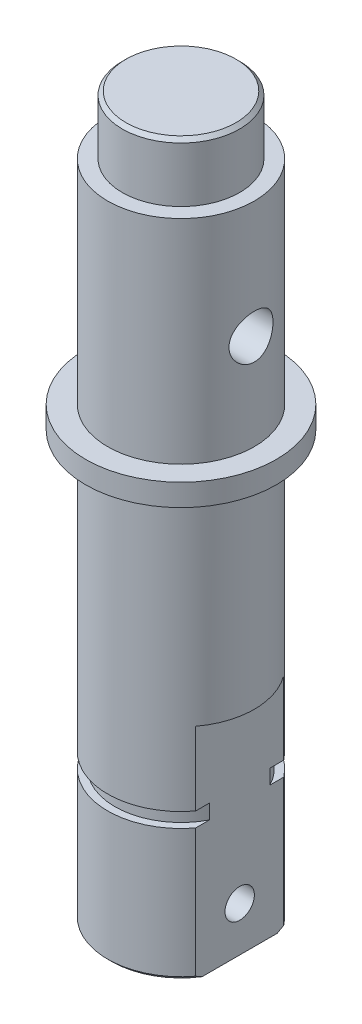
ISO-10303-21;
HEADER;
FILE_DESCRIPTION(('STEP AP214'),'2;1');
FILE_NAME('part.step','',(''),(''),'','','');
FILE_SCHEMA(('AUTOMOTIVE_DESIGN { 1 0 10303 214 1 1 1 1 }'));
ENDSEC;
DATA;
#1=APPLICATION_CONTEXT('core data for automotive mechanical design processes');
#2=APPLICATION_PROTOCOL_DEFINITION('international standard','automotive_design',2000,#1);
#3=PRODUCT_CONTEXT('',#1,'mechanical');
#4=PRODUCT('Part','Part','',(#3));
#5=PRODUCT_RELATED_PRODUCT_CATEGORY('part','',(#4));
#6=PRODUCT_DEFINITION_FORMATION('','',#4);
#7=PRODUCT_DEFINITION_CONTEXT('part definition',#1,'design');
#8=PRODUCT_DEFINITION('design','',#6,#7);
#9=PRODUCT_DEFINITION_SHAPE('','',#8);
#10=(LENGTH_UNIT() NAMED_UNIT(*) SI_UNIT(.MILLI.,.METRE.));
#11=(NAMED_UNIT(*) PLANE_ANGLE_UNIT() SI_UNIT($,.RADIAN.));
#12=(NAMED_UNIT(*) SI_UNIT($,.STERADIAN.) SOLID_ANGLE_UNIT());
#13=UNCERTAINTY_MEASURE_WITH_UNIT(LENGTH_MEASURE(1.E-05),#10,'distance_accuracy_value','');
#14=(GEOMETRIC_REPRESENTATION_CONTEXT(3) GLOBAL_UNCERTAINTY_ASSIGNED_CONTEXT((#13)) GLOBAL_UNIT_ASSIGNED_CONTEXT((#10,
#11,#12)) REPRESENTATION_CONTEXT('',''));
#15=CARTESIAN_POINT('',(0.,0.,0.));
#16=DIRECTION('',(0.,0.,1.));
#17=DIRECTION('',(1.,0.,0.));
#18=AXIS2_PLACEMENT_3D('',#15,#16,#17);
#19=CARTESIAN_POINT('',(0.,23.1069958847737,0.));
#20=DIRECTION('',(0.,-1.,0.));
#21=DIRECTION('',(0.,0.,-1.));
#22=AXIS2_PLACEMENT_3D('',#19,#20,#21);
#23=CYLINDRICAL_SURFACE('',#22,5.);
#24=CARTESIAN_POINT('',(0.,-20.8930041152263,0.));
#25=DIRECTION('',(0.,-1.,0.));
#26=DIRECTION('',(0.,0.,-1.));
#27=AXIS2_PLACEMENT_3D('',#24,#25,#26);
#28=CIRCLE('',#27,5.);
#29=CARTESIAN_POINT('',(4.,-20.8930041152263,3.));
#30=VERTEX_POINT('',#29);
#31=CARTESIAN_POINT('',(4.,-20.8930041152263,-3.));
#32=VERTEX_POINT('',#31);
#33=EDGE_CURVE('E283',#30,#32,#28,.T.);
#34=ORIENTED_EDGE('',*,*,#33,.F.);
#35=DIRECTION('',(0.,-1.,0.));
#36=VECTOR('',#35,1.);
#37=CARTESIAN_POINT('',(4.,-2.43938006815263,3.));
#38=LINE('',#37,#36);
#39=CARTESIAN_POINT('',(4.,-15.8930041152263,3.));
#40=VERTEX_POINT('',#39);
#41=EDGE_CURVE('E325',#40,#30,#38,.T.);
#42=ORIENTED_EDGE('',*,*,#41,.F.);
#43=CARTESIAN_POINT('',(0.,-15.8930041152263,0.));
#44=DIRECTION('',(0.,-1.,0.));
#45=DIRECTION('',(0.,0.,-1.));
#46=AXIS2_PLACEMENT_3D('',#43,#44,#45);
#47=CIRCLE('',#46,5.);
#48=CARTESIAN_POINT('',(4.,-15.8930041152263,-3.));
#49=VERTEX_POINT('',#48);
#50=EDGE_CURVE('E306',#49,#40,#47,.T.);
#51=ORIENTED_EDGE('',*,*,#50,.F.);
#52=DIRECTION('',(0.,-1.,0.));
#53=VECTOR('',#52,1.);
#54=CARTESIAN_POINT('',(4.,-2.43938006815263,-3.));
#55=LINE('',#54,#53);
#56=EDGE_CURVE('E320',#49,#32,#55,.T.);
#57=ORIENTED_EDGE('',*,*,#56,.T.);
#58=EDGE_LOOP('',(#34,#42,#51,#57));
#59=FACE_BOUND('',#58,.T.);
#60=CARTESIAN_POINT('',(0.,-1.89300411522634,0.));
#61=DIRECTION('',(0.,1.,0.));
#62=DIRECTION('',(0.,0.,1.));
#63=AXIS2_PLACEMENT_3D('',#60,#61,#62);
#64=CIRCLE('',#63,5.);
#65=CARTESIAN_POINT('',(0.,-1.89300411522634,5.));
#66=VERTEX_POINT('',#65);
#67=EDGE_CURVE('E294',#66,#66,#64,.T.);
#68=ORIENTED_EDGE('',*,*,#67,.F.);
#69=EDGE_LOOP('',(#68));
#70=FACE_BOUND('',#69,.T.);
#71=ADVANCED_FACE('F202',(#59,#70),#23,.T.);
#72=CARTESIAN_POINT('',(0.,-30.8930041152263,0.));
#73=DIRECTION('',(0.,-1.,0.));
#74=DIRECTION('',(0.,0.,-1.));
#75=AXIS2_PLACEMENT_3D('',#72,#73,#74);
#76=PLANE('',#75);
#77=DIRECTION('',(0.,0.,1.));
#78=VECTOR('',#77,1.);
#79=CARTESIAN_POINT('',(4.,-30.8930041152263,3.));
#80=LINE('',#79,#78);
#81=CARTESIAN_POINT('',(4.,-30.8930041152263,-2.5617376914899));
#82=VERTEX_POINT('',#81);
#83=CARTESIAN_POINT('',(4.,-30.8930041152263,2.56173769148991));
#84=VERTEX_POINT('',#83);
#85=EDGE_CURVE('E328',#82,#84,#80,.T.);
#86=ORIENTED_EDGE('',*,*,#85,.T.);
#87=CARTESIAN_POINT('',(0.,-30.8930041152263,0.));
#88=DIRECTION('',(0.,-1.,0.));
#89=DIRECTION('',(0.,0.,-1.));
#90=AXIS2_PLACEMENT_3D('',#87,#88,#89);
#91=CIRCLE('',#90,4.75);
#92=EDGE_CURVE('E421',#84,#82,#91,.T.);
#93=ORIENTED_EDGE('',*,*,#92,.T.);
#94=EDGE_LOOP('',(#86,#93));
#95=FACE_BOUND('',#94,.T.);
#96=CARTESIAN_POINT('',(0.,-30.8930041152263,0.));
#97=DIRECTION('',(0.,-1.,0.));
#98=DIRECTION('',(0.,0.,-1.));
#99=AXIS2_PLACEMENT_3D('',#96,#97,#98);
#100=CIRCLE('',#99,2.1);
#101=CARTESIAN_POINT('',(0.,-30.8930041152263,-2.1));
#102=VERTEX_POINT('',#101);
#103=EDGE_CURVE('E312',#102,#102,#100,.T.);
#104=ORIENTED_EDGE('',*,*,#103,.F.);
#105=EDGE_LOOP('',(#104));
#106=FACE_BOUND('',#105,.T.);
#107=ADVANCED_FACE('F382',(#95,#106),#76,.T.);
#108=CARTESIAN_POINT('',(0.,-15.8930041152263,0.));
#109=DIRECTION('',(0.,-1.,0.));
#110=DIRECTION('',(0.,0.,-1.));
#111=AXIS2_PLACEMENT_3D('',#108,#109,#110);
#112=PLANE('',#111);
#113=DIRECTION('',(0.,0.,-1.));
#114=VECTOR('',#113,1.);
#115=CARTESIAN_POINT('',(4.,-15.8930041152263,3.));
#116=LINE('',#115,#114);
#117=EDGE_CURVE('E316',#40,#49,#116,.T.);
#118=ORIENTED_EDGE('',*,*,#117,.T.);
#119=ORIENTED_EDGE('',*,*,#50,.T.);
#120=EDGE_LOOP('',(#118,#119));
#121=FACE_BOUND('',#120,.T.);
#122=ADVANCED_FACE('F387',(#121),#112,.T.);
#123=CARTESIAN_POINT('',(0.,-30.8930041152263,0.));
#124=DIRECTION('',(0.,1.,0.));
#125=DIRECTION('',(0.,0.,1.));
#126=AXIS2_PLACEMENT_3D('',#123,#124,#125);
#127=CYLINDRICAL_SURFACE('',#126,5.);
#128=CARTESIAN_POINT('',(4.,-21.8930041152263,-3.));
#129=VERTEX_POINT('',#128);
#130=CARTESIAN_POINT('',(4.,-30.6430041152263,-3.));
#131=VERTEX_POINT('',#130);
#132=EDGE_CURVE('E286',#129,#131,#55,.T.);
#133=ORIENTED_EDGE('',*,*,#132,.T.);
#134=CARTESIAN_POINT('',(0.,-30.6430041152263,0.));
#135=DIRECTION('',(0.,-1.,0.));
#136=DIRECTION('',(0.,0.,-1.));
#137=AXIS2_PLACEMENT_3D('',#134,#135,#136);
#138=CIRCLE('',#137,5.);
#139=CARTESIAN_POINT('',(4.,-30.6430041152263,3.));
#140=VERTEX_POINT('',#139);
#141=EDGE_CURVE('E14',#131,#140,#138,.F.);
#142=ORIENTED_EDGE('',*,*,#141,.T.);
#143=CARTESIAN_POINT('',(4.,-21.8930041152263,3.));
#144=VERTEX_POINT('',#143);
#145=EDGE_CURVE('E324',#144,#140,#38,.T.);
#146=ORIENTED_EDGE('',*,*,#145,.F.);
#147=CARTESIAN_POINT('',(0.,-21.8930041152263,0.));
#148=DIRECTION('',(0.,-1.,0.));
#149=DIRECTION('',(0.,0.,-1.));
#150=AXIS2_PLACEMENT_3D('',#147,#148,#149);
#151=CIRCLE('',#150,5.);
#152=EDGE_CURVE('E332',#144,#129,#151,.T.);
#153=ORIENTED_EDGE('',*,*,#152,.T.);
#154=EDGE_LOOP('',(#133,#142,#146,#153));
#155=FACE_BOUND('',#154,.T.);
#156=ADVANCED_FACE('F390',(#155),#127,.T.);
#157=CARTESIAN_POINT('',(0.,-20.8930041152263,0.));
#158=DIRECTION('',(0.,-1.,0.));
#159=DIRECTION('',(0.,0.,-1.));
#160=AXIS2_PLACEMENT_3D('',#157,#158,#159);
#161=CYLINDRICAL_SURFACE('',#160,2.1);
#162=CARTESIAN_POINT('',(1.84661853126194,-27.8438889588282,-1.));
#163=CARTESIAN_POINT('',(1.84662237127644,-27.89637221571,-0.999996752187028));
#164=CARTESIAN_POINT('',(1.84888935659161,-27.9489301959051,-0.995841210175836));
#165=CARTESIAN_POINT('',(1.85763927181318,-28.0524630046315,-0.979417128219833));
#166=CARTESIAN_POINT('',(1.86413188573762,-28.1034339141696,-0.967129951636969));
#167=CARTESIAN_POINT('',(1.88041434749205,-28.2021032744495,-0.935072336947495));
#168=CARTESIAN_POINT('',(1.89018790860807,-28.2498165152866,-0.915338803874525));
#169=CARTESIAN_POINT('',(1.91190608892623,-28.3412436168553,-0.869060602362351));
#170=CARTESIAN_POINT('',(1.92385064460335,-28.3849575945524,-0.842516133207165));
#171=CARTESIAN_POINT('',(1.94965447067472,-28.4707461460499,-0.78104893857881));
#172=CARTESIAN_POINT('',(1.96359008377842,-28.5124564572473,-0.745649630998119));
#173=CARTESIAN_POINT('',(1.99118689472149,-28.589627279837,-0.668471668752211));
#174=CARTESIAN_POINT('',(2.00484796351014,-28.6250849103212,-0.626690089929755));
#175=CARTESIAN_POINT('',(2.03133419733058,-28.6908114354431,-0.534878167793545));
#176=CARTESIAN_POINT('',(2.04406064286191,-28.7206437042442,-0.484504119188912));
#177=CARTESIAN_POINT('',(2.06627030466236,-28.7712463206676,-0.378733687342475));
#178=CARTESIAN_POINT('',(2.07575538100244,-28.7920218674146,-0.323340207688247));
#179=CARTESIAN_POINT('',(2.08986631664281,-28.8225162867909,-0.21295268168905));
#180=CARTESIAN_POINT('',(2.09476995233883,-28.8328706795375,-0.158170486727856));
#181=CARTESIAN_POINT('',(2.10019406715104,-28.8443099431249,-0.0474429412678622));
#182=CARTESIAN_POINT('',(2.10071692103271,-28.8453998361365,0.00850176255816167));
#183=CARTESIAN_POINT('',(2.09746209863556,-28.8385513095258,0.115236785806712));
#184=CARTESIAN_POINT('',(2.09402113454796,-28.8313198147184,0.166084946589128));
#185=CARTESIAN_POINT('',(2.08372031814658,-28.809282633037,0.265744133905885));
#186=CARTESIAN_POINT('',(2.07686021153775,-28.7944763827965,0.314555008626594));
#187=CARTESIAN_POINT('',(2.06023304584081,-28.7575817317554,0.409641060196139));
#188=CARTESIAN_POINT('',(2.05042478998068,-28.7353896170359,0.455868492556666));
#189=CARTESIAN_POINT('',(2.02880812774259,-28.6844798676312,0.544060907608755));
#190=CARTESIAN_POINT('',(2.01699899036788,-28.6557598467438,0.586024323500411));
#191=CARTESIAN_POINT('',(1.99128906449565,-28.5897021478193,0.668423770962941));
#192=CARTESIAN_POINT('',(1.97729566399329,-28.55182927962,0.708402313669798));
#193=CARTESIAN_POINT('',(1.94949341671408,-28.4699922957044,0.781674034177194));
#194=CARTESIAN_POINT('',(1.93568469454262,-28.4260242744465,0.814962891710761));
#195=CARTESIAN_POINT('',(1.90903651845527,-28.3303445555499,0.875635211468864));
#196=CARTESIAN_POINT('',(1.89628831750601,-28.2783445764768,0.902607945075059));
#197=CARTESIAN_POINT('',(1.87440592194645,-28.1697852805658,0.94722040975269));
#198=CARTESIAN_POINT('',(1.86526827374872,-28.1132303832807,0.964869065021731));
#199=CARTESIAN_POINT('',(1.85258933011833,-28.0017300756135,0.988982418853059));
#200=CARTESIAN_POINT('',(1.84867444991125,-27.9469907384272,0.996197262985026));
#201=CARTESIAN_POINT('',(1.84581446376703,-27.8369554758209,1.00148931490207));
#202=CARTESIAN_POINT('',(1.84686652636786,-27.7816598854364,0.999571728727097));
#203=CARTESIAN_POINT('',(1.85342774455291,-27.6776404643061,0.987341460830173));
#204=CARTESIAN_POINT('',(1.85850573674822,-27.6287898838747,0.977840317787098));
#205=CARTESIAN_POINT('',(1.87193502262553,-27.5334518707072,0.951877729501883));
#206=CARTESIAN_POINT('',(1.88028726499209,-27.4869651272857,0.935414266881201));
#207=CARTESIAN_POINT('',(1.89978387869,-27.3952432234688,0.89517660227923));
#208=CARTESIAN_POINT('',(1.91103957566738,-27.3501655398687,0.871099335484014));
#209=CARTESIAN_POINT('',(1.93495842144264,-27.2644392338398,0.816591218392711));
#210=CARTESIAN_POINT('',(1.94762227485256,-27.2237928490686,0.786157180550131));
#211=CARTESIAN_POINT('',(1.97463922160505,-27.1433217008853,0.715801611370106));
#212=CARTESIAN_POINT('',(1.98902252842513,-27.1040999166345,0.675198952795952));
#213=CARTESIAN_POINT('',(2.01660254143122,-27.0328613774536,0.587721393097978));
#214=CARTESIAN_POINT('',(2.02979895846437,-27.0008463754171,0.540844970428455));
#215=CARTESIAN_POINT('',(2.05383735274376,-26.944494811542,0.44094683783894));
#216=CARTESIAN_POINT('',(2.06463353867236,-26.9203041363204,0.387831068598276));
#217=CARTESIAN_POINT('',(2.08231345937291,-26.8814278118577,0.27762412253159));
#218=CARTESIAN_POINT('',(2.08920030539411,-26.8667346027603,0.220536147723609));
#219=CARTESIAN_POINT('',(2.09783091161925,-26.8484229256238,0.109303351535771));
#220=CARTESIAN_POINT('',(2.09996579763191,-26.8439612286752,0.0553272172630659));
#221=CARTESIAN_POINT('',(2.10003333779542,-26.8438185047126,-0.0526319859662144));
#222=CARTESIAN_POINT('',(2.09796720146642,-26.8481349503757,-0.106615048453541));
#223=CARTESIAN_POINT('',(2.09009147577032,-26.864842746404,-0.209885856471513));
#224=CARTESIAN_POINT('',(2.08449825522818,-26.8767678144239,-0.259267161632187));
#225=CARTESIAN_POINT('',(2.07029995352329,-26.9077633627398,-0.355266682223221));
#226=CARTESIAN_POINT('',(2.061694399651,-26.9268349645367,-0.401884462644862));
#227=CARTESIAN_POINT('',(2.04178350558148,-26.9724990207883,-0.49336601520377));
#228=CARTESIAN_POINT('',(2.03037438207522,-26.9993904471138,-0.53805732223791));
#229=CARTESIAN_POINT('',(2.00610143696376,-27.0595421627268,-0.622486931809101));
#230=CARTESIAN_POINT('',(1.99323695264563,-27.0928053582805,-0.66222296045654));
#231=CARTESIAN_POINT('',(1.96598570152889,-27.1682793902332,-0.739407730393946));
#232=CARTESIAN_POINT('',(1.95156685512536,-27.211028716462,-0.776320236692151));
#233=CARTESIAN_POINT('',(1.92387684346408,-27.3024137058164,-0.842610319046914));
#234=CARTESIAN_POINT('',(1.91060654720025,-27.351053760258,-0.871982222347515));
#235=CARTESIAN_POINT('',(1.88663080805057,-27.4541074556166,-0.922729128641196));
#236=CARTESIAN_POINT('',(1.87597636077322,-27.5086099586644,-0.943949097986712));
#237=CARTESIAN_POINT('',(1.85919567197083,-27.6210368664126,-0.976595048033136));
#238=CARTESIAN_POINT('',(1.8530542404054,-27.6789490769612,-0.988053903905894));
#239=CARTESIAN_POINT('',(1.84866488035011,-27.7551299437631,-0.996212723814389));
#240=CARTESIAN_POINT('',(1.84789965649245,-27.7728402507585,-0.997631157481412));
#241=CARTESIAN_POINT('',(1.84687581766911,-27.8083271621419,-0.999525371252464));
#242=CARTESIAN_POINT('',(1.8466172299825,-27.8261037700481,-1.00000110059799));
#243=CARTESIAN_POINT('',(1.84661853126194,-27.8438889588282,-1.));
#244=B_SPLINE_CURVE_WITH_KNOTS('',3,(#162,#163,#164,#165,#166,#167,#168,#169,#170,#171,#172,
#173,#174,#175,#176,#177,#178,#179,#180,#181,#182,#183,#184,#185,#186,#187,#188,#189,#190,#191,
#192,#193,#194,#195,#196,#197,#198,#199,#200,#201,#202,#203,#204,#205,#206,#207,#208,#209,#210,
#211,#212,#213,#214,#215,#216,#217,#218,#219,#220,#221,#222,#223,#224,#225,#226,#227,#228,#229,
#230,#231,#232,#233,#234,#235,#236,#237,#238,#239,#240,#241,#242,#243),.UNSPECIFIED.,.T.,.F.,(4,
2,2,2,2,2,2,2,2,2,2,2,2,2,2,2,2,2,2,2,2,2,2,2,2,2,2,2,2,2,2,2,2,2,2,2,2,2,2,2,4),(0.,
0.157375018859336,0.315111975483438,0.472077223466097,0.629037879260763,0.797682542130665,
0.966404705765186,1.14520824981644,1.32390901384964,1.49089543776508,1.65779133462718,
1.81149321876435,1.96520653602001,2.12117642607941,2.27720342111762,2.44692774924543,
2.61676133729973,2.79567221154431,2.97441153619738,3.13952242394397,3.30453919972656,
3.45394158518578,3.60338729067637,3.75974897858477,3.91618926172121,4.09016801652426,
4.26418904227438,4.44128921807256,4.61824825032694,4.77999973266013,4.94170465157178,
5.09434367871749,5.24700666944514,5.40651724129859,5.56610074247311,5.74019020464576,
5.91441025214876,6.09179650963605,6.26858294578914,6.32191030947061,6.37524054440624),.UNSPECIFIED.);
#245=CARTESIAN_POINT('',(1.84661853126194,-27.8438889588282,-1.));
#246=VERTEX_POINT('',#245);
#247=EDGE_CURVE('E341',#246,#246,#244,.T.);
#248=ORIENTED_EDGE('',*,*,#247,.F.);
#249=EDGE_LOOP('',(#248));
#250=FACE_BOUND('',#249,.T.);
#251=ORIENTED_EDGE('',*,*,#103,.T.);
#252=EDGE_LOOP('',(#251));
#253=FACE_BOUND('',#252,.T.);
#254=CARTESIAN_POINT('',(0.,-20.8930041152263,0.));
#255=DIRECTION('',(0.,-1.,0.));
#256=DIRECTION('',(0.,0.,-1.));
#257=AXIS2_PLACEMENT_3D('',#254,#255,#256);
#258=CIRCLE('',#257,2.1);
#259=CARTESIAN_POINT('',(0.,-20.8930041152263,-2.1));
#260=VERTEX_POINT('',#259);
#261=EDGE_CURVE('E311',#260,#260,#258,.T.);
#262=ORIENTED_EDGE('',*,*,#261,.F.);
#263=EDGE_LOOP('',(#262));
#264=FACE_BOUND('',#263,.T.);
#265=ADVANCED_FACE('F385',(#250,#253,#264),#161,.F.);
#266=CARTESIAN_POINT('',(0.,-20.8930041152263,0.));
#267=DIRECTION('',(0.,-1.,0.));
#268=DIRECTION('',(0.,0.,-1.));
#269=AXIS2_PLACEMENT_3D('',#266,#267,#268);
#270=PLANE('',#269);
#271=ORIENTED_EDGE('',*,*,#261,.T.);
#272=EDGE_LOOP('',(#271));
#273=FACE_BOUND('',#272,.T.);
#274=ADVANCED_FACE('F442',(#273),#270,.T.);
#275=CARTESIAN_POINT('',(4.,-2.43938006815263,3.));
#276=DIRECTION('',(1.,0.,0.));
#277=DIRECTION('',(0.,0.,-1.));
#278=AXIS2_PLACEMENT_3D('',#275,#276,#277);
#279=PLANE('',#278);
#280=CARTESIAN_POINT('',(4.,-27.8438889588282,0.));
#281=DIRECTION('',(1.,0.,0.));
#282=DIRECTION('',(0.,0.,-1.));
#283=AXIS2_PLACEMENT_3D('',#280,#281,#282);
#284=CIRCLE('',#283,1.);
#285=CARTESIAN_POINT('',(4.,-27.8438889588282,-1.));
#286=VERTEX_POINT('',#285);
#287=EDGE_CURVE('E351',#286,#286,#284,.T.);
#288=ORIENTED_EDGE('',*,*,#287,.F.);
#289=EDGE_LOOP('',(#288));
#290=FACE_BOUND('',#289,.T.);
#291=ORIENTED_EDGE('',*,*,#85,.F.);
#292=CARTESIAN_POINT('',(4.,-30.8930041152263,-2.5617376914899));
#293=CARTESIAN_POINT('',(4.,-30.8730421047488,-2.59875081540481));
#294=CARTESIAN_POINT('',(4.,-30.852843145764,-2.63563571594586));
#295=CARTESIAN_POINT('',(4.,-30.8120024771811,-2.70915332770108));
#296=CARTESIAN_POINT('',(4.,-30.7913608259043,-2.74578607130515));
#297=CARTESIAN_POINT('',(4.,-30.749660895697,-2.81881293111154));
#298=CARTESIAN_POINT('',(4.,-30.7286026211496,-2.8552070498189));
#299=CARTESIAN_POINT('',(4.,-30.68609195674,-2.9277708360308));
#300=CARTESIAN_POINT('',(4.,-30.6646395156297,-2.96394047351941));
#301=CARTESIAN_POINT('',(4.,-30.6430041152264,-3.00000000000002));
#302=B_SPLINE_CURVE_WITH_KNOTS('',3,(#292,#293,#294,#295,#296,#297,#298,#299,#300,#301),
.UNSPECIFIED.,.F.,.F.,(4,2,2,2,4),(0.,0.126157532984754,0.252298546571857,0.378438233818185,
0.504594439027767),.UNSPECIFIED.);
#303=EDGE_CURVE('E213',#82,#131,#302,.T.);
#304=ORIENTED_EDGE('',*,*,#303,.T.);
#305=ORIENTED_EDGE('',*,*,#132,.F.);
#306=DIRECTION('',(0.,0.,-1.));
#307=VECTOR('',#306,1.);
#308=CARTESIAN_POINT('',(4.,-21.8930041152263,3.));
#309=LINE('',#308,#307);
#310=CARTESIAN_POINT('',(4.,-21.8930041152263,-2.06155281280883));
#311=VERTEX_POINT('',#310);
#312=EDGE_CURVE('E278',#311,#129,#309,.T.);
#313=ORIENTED_EDGE('',*,*,#312,.F.);
#314=DIRECTION('',(0.,1.,0.));
#315=VECTOR('',#314,1.);
#316=CARTESIAN_POINT('',(4.,-21.8930041152263,-2.06155281280883));
#317=LINE('',#316,#315);
#318=CARTESIAN_POINT('',(4.,-20.8930041152263,-2.06155281280883));
#319=VERTEX_POINT('',#318);
#320=EDGE_CURVE('E263',#319,#311,#317,.F.);
#321=ORIENTED_EDGE('',*,*,#320,.F.);
#322=DIRECTION('',(0.,0.,-1.));
#323=VECTOR('',#322,1.);
#324=CARTESIAN_POINT('',(4.,-20.8930041152263,3.));
#325=LINE('',#324,#323);
#326=EDGE_CURVE('E273',#319,#32,#325,.T.);
#327=ORIENTED_EDGE('',*,*,#326,.T.);
#328=ORIENTED_EDGE('',*,*,#56,.F.);
#329=ORIENTED_EDGE('',*,*,#117,.F.);
#330=ORIENTED_EDGE('',*,*,#41,.T.);
#331=CARTESIAN_POINT('',(4.,-20.8930041152263,2.06155281280883));
#332=VERTEX_POINT('',#331);
#333=EDGE_CURVE('E297',#30,#332,#325,.T.);
#334=ORIENTED_EDGE('',*,*,#333,.T.);
#335=DIRECTION('',(0.,1.,0.));
#336=VECTOR('',#335,1.);
#337=CARTESIAN_POINT('',(4.,-21.8930041152263,2.06155281280883));
#338=LINE('',#337,#336);
#339=CARTESIAN_POINT('',(4.,-21.8930041152263,2.06155281280883));
#340=VERTEX_POINT('',#339);
#341=EDGE_CURVE('E302',#340,#332,#338,.T.);
#342=ORIENTED_EDGE('',*,*,#341,.F.);
#343=EDGE_CURVE('E274',#144,#340,#309,.T.);
#344=ORIENTED_EDGE('',*,*,#343,.F.);
#345=ORIENTED_EDGE('',*,*,#145,.T.);
#346=CARTESIAN_POINT('',(4.,-30.6430041152263,3.));
#347=CARTESIAN_POINT('',(4.,-30.6646395156297,2.96394047351941));
#348=CARTESIAN_POINT('',(4.,-30.68609195674,2.9277708360308));
#349=CARTESIAN_POINT('',(4.,-30.7286026211496,2.85520704981891));
#350=CARTESIAN_POINT('',(4.,-30.749660895697,2.81881293111154));
#351=CARTESIAN_POINT('',(4.,-30.7913608259043,2.74578607130515));
#352=CARTESIAN_POINT('',(4.,-30.8120024771811,2.70915332770108));
#353=CARTESIAN_POINT('',(4.,-30.852843145764,2.63563571594587));
#354=CARTESIAN_POINT('',(4.,-30.8730421047488,2.59875081540483));
#355=CARTESIAN_POINT('',(4.,-30.8930041152264,2.56173769148995));
#356=B_SPLINE_CURVE_WITH_KNOTS('',3,(#346,#347,#348,#349,#350,#351,#352,#353,#354,#355),
.UNSPECIFIED.,.F.,.F.,(4,2,2,2,4),(0.,0.126156205209583,0.252295892455911,0.378436906043011,
0.504594439027765),.UNSPECIFIED.);
#357=EDGE_CURVE('E428',#140,#84,#356,.T.);
#358=ORIENTED_EDGE('',*,*,#357,.T.);
#359=EDGE_LOOP('',(#291,#304,#305,#313,#321,#327,#328,#329,#330,#334,#342,#344,#345,#358));
#360=FACE_BOUND('',#359,.T.);
#361=ADVANCED_FACE('F285',(#290,#360),#279,.T.);
#362=CARTESIAN_POINT('',(0.,-21.8930041152263,0.));
#363=DIRECTION('',(0.,-1.,0.));
#364=DIRECTION('',(0.,0.,-1.));
#365=AXIS2_PLACEMENT_3D('',#362,#363,#364);
#366=PLANE('',#365);
#367=ORIENTED_EDGE('',*,*,#343,.T.);
#368=CARTESIAN_POINT('',(0.,-21.8930041152263,0.));
#369=DIRECTION('',(0.,-1.,0.));
#370=DIRECTION('',(0.,0.,-1.));
#371=AXIS2_PLACEMENT_3D('',#368,#369,#370);
#372=CIRCLE('',#371,4.5);
#373=EDGE_CURVE('E266',#340,#311,#372,.T.);
#374=ORIENTED_EDGE('',*,*,#373,.T.);
#375=ORIENTED_EDGE('',*,*,#312,.T.);
#376=ORIENTED_EDGE('',*,*,#152,.F.);
#377=EDGE_LOOP('',(#367,#374,#375,#376));
#378=FACE_BOUND('',#377,.T.);
#379=ADVANCED_FACE('F277',(#378),#366,.F.);
#380=CARTESIAN_POINT('',(0.,-20.8930041152263,0.));
#381=DIRECTION('',(0.,-1.,0.));
#382=DIRECTION('',(0.,0.,-1.));
#383=AXIS2_PLACEMENT_3D('',#380,#381,#382);
#384=PLANE('',#383);
#385=ORIENTED_EDGE('',*,*,#33,.T.);
#386=ORIENTED_EDGE('',*,*,#326,.F.);
#387=CARTESIAN_POINT('',(0.,-20.8930041152263,0.));
#388=DIRECTION('',(0.,-1.,0.));
#389=DIRECTION('',(0.,0.,-1.));
#390=AXIS2_PLACEMENT_3D('',#387,#388,#389);
#391=CIRCLE('',#390,4.5);
#392=EDGE_CURVE('E269',#332,#319,#391,.T.);
#393=ORIENTED_EDGE('',*,*,#392,.F.);
#394=ORIENTED_EDGE('',*,*,#333,.F.);
#395=EDGE_LOOP('',(#385,#386,#393,#394));
#396=FACE_BOUND('',#395,.T.);
#397=ADVANCED_FACE('F444',(#396),#384,.T.);
#398=CARTESIAN_POINT('',(0.,-21.8930041152263,0.));
#399=DIRECTION('',(0.,1.,0.));
#400=DIRECTION('',(0.,0.,1.));
#401=AXIS2_PLACEMENT_3D('',#398,#399,#400);
#402=CYLINDRICAL_SURFACE('',#401,4.5);
#403=ORIENTED_EDGE('',*,*,#320,.T.);
#404=ORIENTED_EDGE('',*,*,#373,.F.);
#405=ORIENTED_EDGE('',*,*,#341,.T.);
#406=ORIENTED_EDGE('',*,*,#392,.T.);
#407=EDGE_LOOP('',(#403,#404,#405,#406));
#408=FACE_BOUND('',#407,.T.);
#409=ADVANCED_FACE('F265',(#408),#402,.T.);
#410=CARTESIAN_POINT('',(-5.001,-27.8438889588282,0.));
#411=DIRECTION('',(1.,0.,0.));
#412=DIRECTION('',(0.,0.,-1.));
#413=AXIS2_PLACEMENT_3D('',#410,#411,#412);
#414=CYLINDRICAL_SURFACE('',#413,1.);
#415=ORIENTED_EDGE('',*,*,#247,.T.);
#416=EDGE_LOOP('',(#415));
#417=FACE_BOUND('',#416,.T.);
#418=ORIENTED_EDGE('',*,*,#287,.T.);
#419=EDGE_LOOP('',(#418));
#420=FACE_BOUND('',#419,.T.);
#421=ADVANCED_FACE('F353',(#417,#420),#414,.F.);
#422=CARTESIAN_POINT('',(0.,-1.89300411522634,0.));
#423=DIRECTION('',(0.,1.,0.));
#424=DIRECTION('',(0.,0.,1.));
#425=AXIS2_PLACEMENT_3D('',#422,#423,#424);
#426=PLANE('',#425);
#427=ORIENTED_EDGE('',*,*,#67,.T.);
#428=EDGE_LOOP('',(#427));
#429=FACE_BOUND('',#428,.T.);
#430=CARTESIAN_POINT('',(0.,-1.89300411522634,0.));
#431=DIRECTION('',(0.,-1.,0.));
#432=DIRECTION('',(0.,0.,-1.));
#433=AXIS2_PLACEMENT_3D('',#430,#431,#432);
#434=CIRCLE('',#433,6.5);
#435=CARTESIAN_POINT('',(0.,-1.89300411522634,-6.5));
#436=VERTEX_POINT('',#435);
#437=EDGE_CURVE('E487',#436,#436,#434,.T.);
#438=ORIENTED_EDGE('',*,*,#437,.T.);
#439=EDGE_LOOP('',(#438));
#440=FACE_BOUND('',#439,.T.);
#441=ADVANCED_FACE('F466',(#429,#440),#426,.F.);
#442=CARTESIAN_POINT('',(0.,-0.393004115226343,0.));
#443=DIRECTION('',(0.,-1.,0.));
#444=DIRECTION('',(0.,0.,-1.));
#445=AXIS2_PLACEMENT_3D('',#442,#443,#444);
#446=CYLINDRICAL_SURFACE('',#445,6.5);
#447=CARTESIAN_POINT('',(0.,-0.393004115226343,0.));
#448=DIRECTION('',(0.,-1.,0.));
#449=DIRECTION('',(0.,0.,-1.));
#450=AXIS2_PLACEMENT_3D('',#447,#448,#449);
#451=CIRCLE('',#450,6.5);
#452=CARTESIAN_POINT('',(0.,-0.393004115226343,-6.5));
#453=VERTEX_POINT('',#452);
#454=EDGE_CURVE('E486',#453,#453,#451,.T.);
#455=ORIENTED_EDGE('',*,*,#454,.T.);
#456=EDGE_LOOP('',(#455));
#457=FACE_BOUND('',#456,.T.);
#458=ORIENTED_EDGE('',*,*,#437,.F.);
#459=EDGE_LOOP('',(#458));
#460=FACE_BOUND('',#459,.T.);
#461=ADVANCED_FACE('F496',(#457,#460),#446,.T.);
#462=CARTESIAN_POINT('',(0.,-0.393004115226343,0.));
#463=DIRECTION('',(0.,-1.,0.));
#464=DIRECTION('',(0.,0.,-1.));
#465=AXIS2_PLACEMENT_3D('',#462,#463,#464);
#466=PLANE('',#465);
#467=CARTESIAN_POINT('',(0.,-0.393004115226341,0.));
#468=DIRECTION('',(0.,-1.,0.));
#469=DIRECTION('',(0.,0.,-1.));
#470=AXIS2_PLACEMENT_3D('',#467,#468,#469);
#471=CIRCLE('',#470,5.);
#472=CARTESIAN_POINT('',(0.,-0.393004115226341,-5.));
#473=VERTEX_POINT('',#472);
#474=EDGE_CURVE('E417',#473,#473,#471,.T.);
#475=ORIENTED_EDGE('',*,*,#474,.T.);
#476=EDGE_LOOP('',(#475));
#477=FACE_BOUND('',#476,.T.);
#478=ORIENTED_EDGE('',*,*,#454,.F.);
#479=EDGE_LOOP('',(#478));
#480=FACE_BOUND('',#479,.T.);
#481=ADVANCED_FACE('F362',(#477,#480),#466,.F.);
#482=CARTESIAN_POINT('',(0.,18.1069958847737,0.));
#483=DIRECTION('',(0.,1.,0.));
#484=DIRECTION('',(0.,0.,1.));
#485=AXIS2_PLACEMENT_3D('',#482,#483,#484);
#486=PLANE('',#485);
#487=CARTESIAN_POINT('',(0.,18.1069958847737,0.));
#488=DIRECTION('',(0.,1.,0.));
#489=DIRECTION('',(0.,0.,1.));
#490=AXIS2_PLACEMENT_3D('',#487,#488,#489);
#491=CIRCLE('',#490,3.75);
#492=CARTESIAN_POINT('',(0.,18.1069958847737,3.75));
#493=VERTEX_POINT('',#492);
#494=EDGE_CURVE('E415',#493,#493,#491,.T.);
#495=ORIENTED_EDGE('',*,*,#494,.T.);
#496=EDGE_LOOP('',(#495));
#497=FACE_BOUND('',#496,.T.);
#498=ADVANCED_FACE('F358',(#497),#486,.T.);
#499=CARTESIAN_POINT('',(0.,0.,0.));
#500=DIRECTION('',(1.,0.,0.));
#501=DIRECTION('',(0.,0.,-1.));
#502=AXIS2_PLACEMENT_3D('',#499,#500,#501);
#503=PLANE('',#502);
#504=CARTESIAN_POINT('',(0.,6.10699588477366,0.));
#505=DIRECTION('',(1.,0.,0.));
#506=DIRECTION('',(0.,0.,-1.));
#507=AXIS2_PLACEMENT_3D('',#504,#505,#506);
#508=CIRCLE('',#507,1.5);
#509=CARTESIAN_POINT('',(0.,6.10699588477366,-1.5));
#510=VERTEX_POINT('',#509);
#511=EDGE_CURVE('E470',#510,#510,#508,.T.);
#512=ORIENTED_EDGE('',*,*,#511,.T.);
#513=EDGE_LOOP('',(#512));
#514=FACE_BOUND('',#513,.T.);
#515=ADVANCED_FACE('F361',(#514),#503,.T.);
#516=CARTESIAN_POINT('',(0.,14.1069958847737,0.));
#517=DIRECTION('',(0.,1.,0.));
#518=DIRECTION('',(0.,0.,1.));
#519=AXIS2_PLACEMENT_3D('',#516,#517,#518);
#520=CYLINDRICAL_SURFACE('',#519,4.);
#521=CARTESIAN_POINT('',(0.,17.8569958847737,0.));
#522=DIRECTION('',(0.,1.,0.));
#523=DIRECTION('',(0.,0.,1.));
#524=AXIS2_PLACEMENT_3D('',#521,#522,#523);
#525=CIRCLE('',#524,4.);
#526=CARTESIAN_POINT('',(0.,17.8569958847737,4.));
#527=VERTEX_POINT('',#526);
#528=EDGE_CURVE('E412',#527,#527,#525,.F.);
#529=ORIENTED_EDGE('',*,*,#528,.T.);
#530=EDGE_LOOP('',(#529));
#531=FACE_BOUND('',#530,.T.);
#532=CARTESIAN_POINT('',(0.,14.1069958847737,0.));
#533=DIRECTION('',(0.,1.,0.));
#534=DIRECTION('',(0.,0.,1.));
#535=AXIS2_PLACEMENT_3D('',#532,#533,#534);
#536=CIRCLE('',#535,4.);
#537=CARTESIAN_POINT('',(0.,14.1069958847737,4.));
#538=VERTEX_POINT('',#537);
#539=EDGE_CURVE('E480',#538,#538,#536,.T.);
#540=ORIENTED_EDGE('',*,*,#539,.T.);
#541=EDGE_LOOP('',(#540));
#542=FACE_BOUND('',#541,.T.);
#543=ADVANCED_FACE('F369',(#531,#542),#520,.T.);
#544=CARTESIAN_POINT('',(0.,6.10699588477366,0.));
#545=DIRECTION('',(1.,0.,0.));
#546=DIRECTION('',(0.,0.,-1.));
#547=AXIS2_PLACEMENT_3D('',#544,#545,#546);
#548=CYLINDRICAL_SURFACE('',#547,1.5);
#549=ORIENTED_EDGE('',*,*,#511,.F.);
#550=EDGE_LOOP('',(#549));
#551=FACE_BOUND('',#550,.T.);
#552=CARTESIAN_POINT('',(4.76969600708473,6.10699588477366,-1.5));
#553=CARTESIAN_POINT('',(4.7696968572698,6.02480133683125,-1.49999897633764));
#554=CARTESIAN_POINT('',(4.77184390209069,5.94259666062963,-1.49322108167142));
#555=CARTESIAN_POINT('',(4.780165783029,5.78059063518172,-1.46635844446749));
#556=CARTESIAN_POINT('',(4.78634196493468,5.70079009827219,-1.44626925573578));
#557=CARTESIAN_POINT('',(4.80196102485633,5.54596115650193,-1.39352753269955));
#558=CARTESIAN_POINT('',(4.81139846703232,5.47092505514057,-1.36089589394243));
#559=CARTESIAN_POINT('',(4.83246932547567,5.32737395077836,-1.28406421917929));
#560=CARTESIAN_POINT('',(4.84410307041019,5.25885992608922,-1.23986245137053));
#561=CARTESIAN_POINT('',(4.86866862185765,5.12812949419628,-1.13964754141627));
#562=CARTESIAN_POINT('',(4.88162808311636,5.06614998682737,-1.08333207175807));
#563=CARTESIAN_POINT('',(4.90714861936757,4.95235793345115,-0.961136237579597));
#564=CARTESIAN_POINT('',(4.91970964297705,4.90054669432378,-0.89525464546111));
#565=CARTESIAN_POINT('',(4.94333214579389,4.80753318494035,-0.754111437793688));
#566=CARTESIAN_POINT('',(4.95435724342404,4.76657246033085,-0.678684021335813));
#567=CARTESIAN_POINT('',(4.97334435920684,4.6980086257309,-0.521624645369352));
#568=CARTESIAN_POINT('',(4.98130703789495,4.67040263491621,-0.43999402838791));
#569=CARTESIAN_POINT('',(4.99307646003589,4.63011588368315,-0.275323852630828));
#570=CARTESIAN_POINT('',(4.99699557369338,4.61703075712096,-0.192391398953799));
#571=CARTESIAN_POINT('',(5.00063201501348,4.60487856012722,-0.0254218237493131));
#572=CARTESIAN_POINT('',(5.00035022521079,4.6058085453717,0.0586150620503699));
#573=CARTESIAN_POINT('',(4.99569603817659,4.62138875331668,0.222571156600162));
#574=CARTESIAN_POINT('',(4.9914542020526,4.63560107858353,0.302536267641343));
#575=CARTESIAN_POINT('',(4.97951522112593,4.67662722076795,0.458889213442528));
#576=CARTESIAN_POINT('',(4.97181785750586,4.70344183571633,0.535276821322848));
#577=CARTESIAN_POINT('',(4.95365220986963,4.76920790819222,0.683347326351282));
#578=CARTESIAN_POINT('',(4.94315269676706,4.80829708758093,0.754965064694479));
#579=CARTESIAN_POINT('',(4.92049640648069,4.89739373720189,0.890764673783157));
#580=CARTESIAN_POINT('',(4.90833923637778,4.94740379773714,0.954944774872132));
#581=CARTESIAN_POINT('',(4.88311550488165,5.05919363552525,1.0766604815298));
#582=CARTESIAN_POINT('',(4.87003195321461,5.12135280380339,1.13384458040112));
#583=CARTESIAN_POINT('',(4.84483979887497,5.25450590266371,1.23707651539824));
#584=CARTESIAN_POINT('',(4.8327312931702,5.32550071016289,1.28312324482853));
#585=CARTESIAN_POINT('',(4.81077903197678,5.47523535402265,1.3631399533545));
#586=CARTESIAN_POINT('',(4.80095810695957,5.55404293063658,1.39698989237679));
#587=CARTESIAN_POINT('',(4.78496392548436,5.7166030932192,1.45083362878413));
#588=CARTESIAN_POINT('',(4.7787894791583,5.80035405630822,1.4708319464056));
#589=CARTESIAN_POINT('',(4.77104849541241,5.96707824551294,1.49574770282165));
#590=CARTESIAN_POINT('',(4.7693187867044,6.04996410866764,1.50119946380212));
#591=CARTESIAN_POINT('',(4.77021192441924,6.21546878478352,1.49835947233062));
#592=CARTESIAN_POINT('',(4.77283416156589,6.2980876335045,1.4900696437133));
#593=CARTESIAN_POINT('',(4.78197558554912,6.45848426274453,1.4604576357419));
#594=CARTESIAN_POINT('',(4.78839176507489,6.53633204903718,1.4394796143128));
#595=CARTESIAN_POINT('',(4.80429141231227,6.68739757558857,1.3854857774794));
#596=CARTESIAN_POINT('',(4.81377535359073,6.76061459891423,1.3524681034276));
#597=CARTESIAN_POINT('',(4.83505835023047,6.90251334884579,1.27431871196501));
#598=CARTESIAN_POINT('',(4.84691271069799,6.97102060575945,1.22888564172729));
#599=CARTESIAN_POINT('',(4.87148205646987,7.09963399095446,1.12755301600385));
#600=CARTESIAN_POINT('',(4.88419724730003,7.15973810238645,1.07165095534897));
#601=CARTESIAN_POINT('',(4.90963633548158,7.27217629058839,0.948455132493601));
#602=CARTESIAN_POINT('',(4.92234245063004,7.32413151376064,0.880811065857436));
#603=CARTESIAN_POINT('',(4.94584851748651,7.41596258580141,0.73746178459025));
#604=CARTESIAN_POINT('',(4.95664856384717,7.45583903455512,0.661756970543945));
#605=CARTESIAN_POINT('',(4.97505970474957,7.52199591534195,0.504935504705223));
#606=CARTESIAN_POINT('',(4.98269453424966,7.54837790093263,0.423864622037841));
#607=CARTESIAN_POINT('',(4.99401979596827,7.58705680366408,0.25816996650459));
#608=CARTESIAN_POINT('',(4.9977113567088,7.59935775072208,0.173547217354765));
#609=CARTESIAN_POINT('',(5.00066544081399,7.60921892882816,0.00665215388274447));
#610=CARTESIAN_POINT('',(5.00009305111322,7.60732858018149,-0.075585179086205));
#611=CARTESIAN_POINT('',(4.99497264465037,7.59017425227454,-0.238519481164402));
#612=CARTESIAN_POINT('',(4.99042485330462,7.57491103129322,-0.319216537346527));
#613=CARTESIAN_POINT('',(4.97791168358327,7.53178422337403,-0.475935813041357));
#614=CARTESIAN_POINT('',(4.96998352900866,7.50405770412464,-0.55199892735139));
#615=CARTESIAN_POINT('',(4.9515294303945,7.43691397026647,-0.698433237752051));
#616=CARTESIAN_POINT('',(4.94100305949946,7.39749483448747,-0.768803496050578));
#617=CARTESIAN_POINT('',(4.91803965828228,7.30662242734362,-0.904301892420562));
#618=CARTESIAN_POINT('',(4.90555226923559,7.25482445477289,-0.969190250076766));
#619=CARTESIAN_POINT('',(4.88023537212334,7.14128549644086,-1.08953757134594));
#620=CARTESIAN_POINT('',(4.86740576641079,7.07954164687551,-1.14499380960193));
#621=CARTESIAN_POINT('',(4.84240680631319,6.94565510646315,-1.24656269394549));
#622=CARTESIAN_POINT('',(4.83026852693485,6.87325733138322,-1.29234759757956));
#623=CARTESIAN_POINT('',(4.80852547508793,6.72144071061264,-1.37104313528776));
#624=CARTESIAN_POINT('',(4.79891948596955,6.64202526117246,-1.40395995557288));
#625=CARTESIAN_POINT('',(4.78427816717595,6.48725545316738,-1.45301942532949));
#626=CARTESIAN_POINT('',(4.7788615484052,6.41238723784266,-1.47058859011231));
#627=CARTESIAN_POINT('',(4.77157042597167,6.26068066227788,-1.49407818835144));
#628=CARTESIAN_POINT('',(4.76969521221431,6.18384270012841,-1.50000095706095));
#629=CARTESIAN_POINT('',(4.76969600708473,6.10699588477366,-1.5));
#630=B_SPLINE_CURVE_WITH_KNOTS('',3,(#552,#553,#554,#555,#556,#557,#558,#559,#560,#561,#562,
#563,#564,#565,#566,#567,#568,#569,#570,#571,#572,#573,#574,#575,#576,#577,#578,#579,#580,#581,
#582,#583,#584,#585,#586,#587,#588,#589,#590,#591,#592,#593,#594,#595,#596,#597,#598,#599,#600,
#601,#602,#603,#604,#605,#606,#607,#608,#609,#610,#611,#612,#613,#614,#615,#616,#617,#618,#619,
#620,#621,#622,#623,#624,#625,#626,#627,#628,#629),.UNSPECIFIED.,.T.,.F.,(4,2,2,2,2,2,2,2,2,2,2,
2,2,2,2,2,2,2,2,2,2,2,2,2,2,2,2,2,2,2,2,2,2,2,2,2,2,2,4),(0.,0.246300165915542,0.492682641689,
0.738656414466193,0.984667025370101,1.23773150007984,1.49082847871273,1.74915939273645,
2.00743455587877,2.25832140149558,2.5091555410144,2.7520012599088,2.99486235890376,
3.24055209335676,3.4863001659083,3.74152147023278,3.99676812491863,4.25446238246266,
4.51207250628411,4.76008080790309,5.00805439107388,5.24958594938817,5.49115481045787,
5.73920731809388,5.98731925928923,6.24479506100602,6.50225807324202,6.75775391814325,
7.01317662321682,7.2587630391122,7.50433553047754,7.74727096872219,7.99024634491378,
8.24099627054488,8.4918185262989,8.75011639669147,9.00828993963944,9.23861153857448,
9.4688869503356),.UNSPECIFIED.);
#631=CARTESIAN_POINT('',(4.76969600708473,6.10699588477366,-1.5));
#632=VERTEX_POINT('',#631);
#633=EDGE_CURVE('E288',#632,#632,#630,.T.);
#634=ORIENTED_EDGE('',*,*,#633,.F.);
#635=EDGE_LOOP('',(#634));
#636=FACE_BOUND('',#635,.T.);
#637=ADVANCED_FACE('F364',(#551,#636),#548,.F.);
#638=CARTESIAN_POINT('',(0.,14.1069958847737,0.));
#639=DIRECTION('',(0.,1.,0.));
#640=DIRECTION('',(0.,0.,1.));
#641=AXIS2_PLACEMENT_3D('',#638,#639,#640);
#642=PLANE('',#641);
#643=ORIENTED_EDGE('',*,*,#539,.F.);
#644=EDGE_LOOP('',(#643));
#645=FACE_BOUND('',#644,.T.);
#646=CARTESIAN_POINT('',(0.,14.1069958847737,0.));
#647=DIRECTION('',(0.,1.,0.));
#648=DIRECTION('',(0.,0.,1.));
#649=AXIS2_PLACEMENT_3D('',#646,#647,#648);
#650=CIRCLE('',#649,5.);
#651=CARTESIAN_POINT('',(0.,14.1069958847737,5.));
#652=VERTEX_POINT('',#651);
#653=EDGE_CURVE('E474',#652,#652,#650,.T.);
#654=ORIENTED_EDGE('',*,*,#653,.T.);
#655=EDGE_LOOP('',(#654));
#656=FACE_BOUND('',#655,.T.);
#657=ADVANCED_FACE('F368',(#645,#656),#642,.T.);
#658=ORIENTED_EDGE('',*,*,#653,.F.);
#659=EDGE_LOOP('',(#658));
#660=FACE_BOUND('',#659,.T.);
#661=ORIENTED_EDGE('',*,*,#633,.T.);
#662=EDGE_LOOP('',(#661));
#663=FACE_BOUND('',#662,.T.);
#664=ORIENTED_EDGE('',*,*,#474,.F.);
#665=EDGE_LOOP('',(#664));
#666=FACE_BOUND('',#665,.T.);
#667=ADVANCED_FACE('F384',(#660,#663,#666),#23,.T.);
#668=CARTESIAN_POINT('',(0.,18.1069958847737,0.));
#669=DIRECTION('',(0.,-1.,0.));
#670=DIRECTION('',(0.,0.,-1.));
#671=AXIS2_PLACEMENT_3D('',#668,#669,#670);
#672=CONICAL_SURFACE('',#671,3.75,0.785398163397462);
#673=ORIENTED_EDGE('',*,*,#528,.F.);
#674=EDGE_LOOP('',(#673));
#675=FACE_BOUND('',#674,.T.);
#676=ORIENTED_EDGE('',*,*,#494,.F.);
#677=EDGE_LOOP('',(#676));
#678=FACE_BOUND('',#677,.T.);
#679=ADVANCED_FACE('F397',(#675,#678),#672,.T.);
#680=CARTESIAN_POINT('',(0.,-30.8930041152263,0.));
#681=DIRECTION('',(0.,1.,0.));
#682=DIRECTION('',(0.,0.,1.));
#683=AXIS2_PLACEMENT_3D('',#680,#681,#682);
#684=CONICAL_SURFACE('',#683,4.75,0.785398163397447);
#685=ORIENTED_EDGE('',*,*,#357,.F.);
#686=ORIENTED_EDGE('',*,*,#141,.F.);
#687=ORIENTED_EDGE('',*,*,#303,.F.);
#688=ORIENTED_EDGE('',*,*,#92,.F.);
#689=EDGE_LOOP('',(#685,#686,#687,#688));
#690=FACE_BOUND('',#689,.T.);
#691=ADVANCED_FACE('F205',(#690),#684,.T.);
#692=CLOSED_SHELL('',(#71,#107,#122,#156,#265,#274,#361,#379,#397,#409,#421,#441,#461,#481,#498,
#515,#543,#637,#657,#667,#679,#691));
#693=MANIFOLD_SOLID_BREP('B2',#692);
#694=ADVANCED_BREP_SHAPE_REPRESENTATION('',(#18,#693),#14);
#695=SHAPE_DEFINITION_REPRESENTATION(#9,#694);
ENDSEC;
END-ISO-10303-21;
